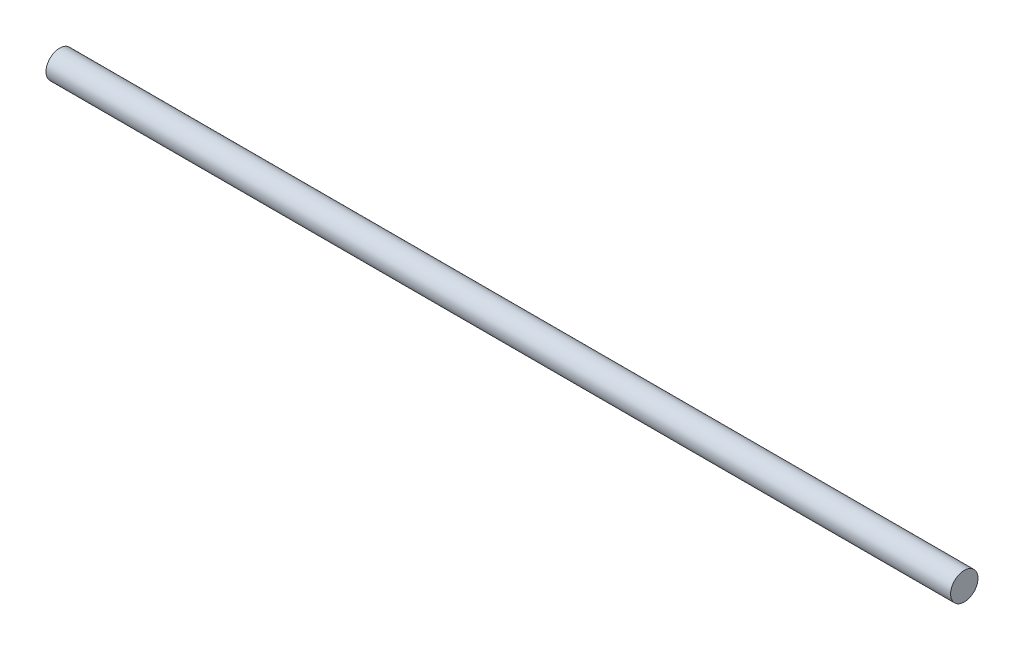
ISO-10303-21;
HEADER;
FILE_DESCRIPTION(('STEP AP214'),'2;1');
FILE_NAME('part.step','',(''),(''),'','','');
FILE_SCHEMA(('AUTOMOTIVE_DESIGN { 1 0 10303 214 1 1 1 1 }'));
ENDSEC;
DATA;
#1=APPLICATION_CONTEXT('core data for automotive mechanical design processes');
#2=APPLICATION_PROTOCOL_DEFINITION('international standard','automotive_design',2000,#1);
#3=PRODUCT_CONTEXT('',#1,'mechanical');
#4=PRODUCT('Part','Part','',(#3));
#5=PRODUCT_RELATED_PRODUCT_CATEGORY('part','',(#4));
#6=PRODUCT_DEFINITION_FORMATION('','',#4);
#7=PRODUCT_DEFINITION_CONTEXT('part definition',#1,'design');
#8=PRODUCT_DEFINITION('design','',#6,#7);
#9=PRODUCT_DEFINITION_SHAPE('','',#8);
#10=(LENGTH_UNIT() NAMED_UNIT(*) SI_UNIT(.MILLI.,.METRE.));
#11=(NAMED_UNIT(*) PLANE_ANGLE_UNIT() SI_UNIT($,.RADIAN.));
#12=(NAMED_UNIT(*) SI_UNIT($,.STERADIAN.) SOLID_ANGLE_UNIT());
#13=UNCERTAINTY_MEASURE_WITH_UNIT(LENGTH_MEASURE(1.E-05),#10,'distance_accuracy_value','');
#14=(GEOMETRIC_REPRESENTATION_CONTEXT(3) GLOBAL_UNCERTAINTY_ASSIGNED_CONTEXT((#13)) GLOBAL_UNIT_ASSIGNED_CONTEXT((#10,
#11,#12)) REPRESENTATION_CONTEXT('',''));
#15=CARTESIAN_POINT('',(0.,0.,0.));
#16=DIRECTION('',(0.,0.,1.));
#17=DIRECTION('',(1.,0.,0.));
#18=AXIS2_PLACEMENT_3D('',#15,#16,#17);
#19=CARTESIAN_POINT('',(209.55,0.,0.));
#20=DIRECTION('',(-1.,0.,0.));
#21=DIRECTION('',(0.,0.,1.));
#22=AXIS2_PLACEMENT_3D('',#19,#20,#21);
#23=CYLINDRICAL_SURFACE('',#22,3.175);
#24=CARTESIAN_POINT('',(209.55,0.,0.));
#25=DIRECTION('',(1.,0.,0.));
#26=DIRECTION('',(0.,0.,-1.));
#27=AXIS2_PLACEMENT_3D('',#24,#25,#26);
#28=CIRCLE('',#27,3.175);
#29=CARTESIAN_POINT('',(209.55,0.,-3.175));
#30=VERTEX_POINT('',#29);
#31=EDGE_CURVE('E10',#30,#30,#28,.T.);
#32=ORIENTED_EDGE('',*,*,#31,.F.);
#33=EDGE_LOOP('',(#32));
#34=FACE_BOUND('',#33,.T.);
#35=CARTESIAN_POINT('',(0.,0.,0.));
#36=DIRECTION('',(1.,0.,0.));
#37=DIRECTION('',(0.,0.,-1.));
#38=AXIS2_PLACEMENT_3D('',#35,#36,#37);
#39=CIRCLE('',#38,3.175);
#40=CARTESIAN_POINT('',(0.,0.,-3.175));
#41=VERTEX_POINT('',#40);
#42=EDGE_CURVE('E40',#41,#41,#39,.T.);
#43=ORIENTED_EDGE('',*,*,#42,.T.);
#44=EDGE_LOOP('',(#43));
#45=FACE_BOUND('',#44,.T.);
#46=ADVANCED_FACE('F37',(#34,#45),#23,.T.);
#47=CARTESIAN_POINT('',(209.55,0.,0.));
#48=DIRECTION('',(1.,0.,0.));
#49=DIRECTION('',(0.,0.,-1.));
#50=AXIS2_PLACEMENT_3D('',#47,#48,#49);
#51=PLANE('',#50);
#52=ORIENTED_EDGE('',*,*,#31,.T.);
#53=EDGE_LOOP('',(#52));
#54=FACE_BOUND('',#53,.T.);
#55=ADVANCED_FACE('F54',(#54),#51,.T.);
#56=CARTESIAN_POINT('',(0.,0.,0.));
#57=DIRECTION('',(1.,0.,0.));
#58=DIRECTION('',(0.,0.,-1.));
#59=AXIS2_PLACEMENT_3D('',#56,#57,#58);
#60=PLANE('',#59);
#61=ORIENTED_EDGE('',*,*,#42,.F.);
#62=EDGE_LOOP('',(#61));
#63=FACE_BOUND('',#62,.T.);
#64=ADVANCED_FACE('F52',(#63),#60,.F.);
#65=CLOSED_SHELL('',(#46,#55,#64));
#66=MANIFOLD_SOLID_BREP('B2',#65);
#67=ADVANCED_BREP_SHAPE_REPRESENTATION('',(#18,#66),#14);
#68=SHAPE_DEFINITION_REPRESENTATION(#9,#67);
ENDSEC;
END-ISO-10303-21;
